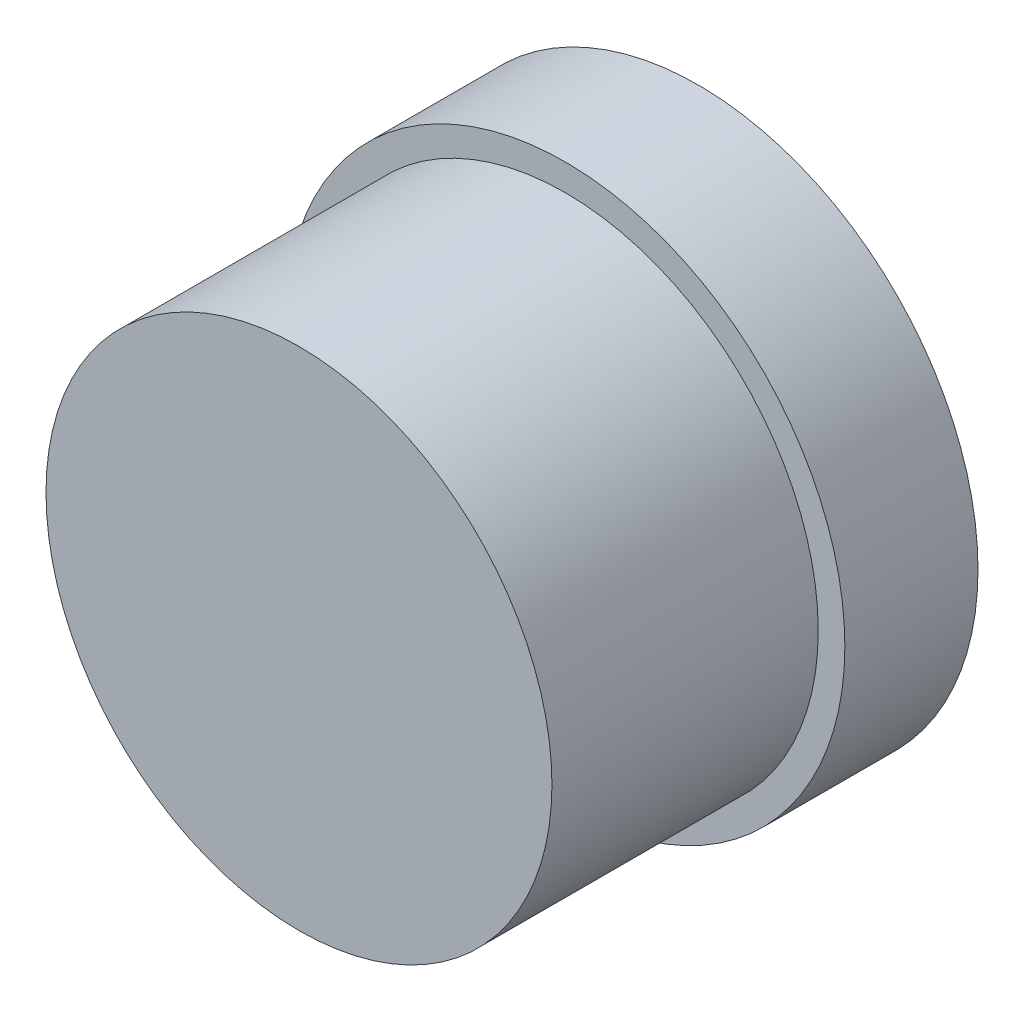
ISO-10303-21;
HEADER;
FILE_DESCRIPTION(('STEP AP214'),'2;1');
FILE_NAME('part.step','',(''),(''),'','','');
FILE_SCHEMA(('AUTOMOTIVE_DESIGN { 1 0 10303 214 1 1 1 1 }'));
ENDSEC;
DATA;
#1=APPLICATION_CONTEXT('core data for automotive mechanical design processes');
#2=APPLICATION_PROTOCOL_DEFINITION('international standard','automotive_design',2000,#1);
#3=PRODUCT_CONTEXT('',#1,'mechanical');
#4=PRODUCT('Part','Part','',(#3));
#5=PRODUCT_RELATED_PRODUCT_CATEGORY('part','',(#4));
#6=PRODUCT_DEFINITION_FORMATION('','',#4);
#7=PRODUCT_DEFINITION_CONTEXT('part definition',#1,'design');
#8=PRODUCT_DEFINITION('design','',#6,#7);
#9=PRODUCT_DEFINITION_SHAPE('','',#8);
#10=(LENGTH_UNIT() NAMED_UNIT(*) SI_UNIT(.MILLI.,.METRE.));
#11=(NAMED_UNIT(*) PLANE_ANGLE_UNIT() SI_UNIT($,.RADIAN.));
#12=(NAMED_UNIT(*) SI_UNIT($,.STERADIAN.) SOLID_ANGLE_UNIT());
#13=UNCERTAINTY_MEASURE_WITH_UNIT(LENGTH_MEASURE(1.E-05),#10,'distance_accuracy_value','');
#14=(GEOMETRIC_REPRESENTATION_CONTEXT(3) GLOBAL_UNCERTAINTY_ASSIGNED_CONTEXT((#13)) GLOBAL_UNIT_ASSIGNED_CONTEXT((#10,
#11,#12)) REPRESENTATION_CONTEXT('',''));
#15=CARTESIAN_POINT('',(0.,0.,0.));
#16=DIRECTION('',(0.,0.,1.));
#17=DIRECTION('',(1.,0.,0.));
#18=AXIS2_PLACEMENT_3D('',#15,#16,#17);
#19=CARTESIAN_POINT('',(0.,0.,100.));
#20=DIRECTION('',(0.,0.,-1.));
#21=DIRECTION('',(-1.,0.,0.));
#22=AXIS2_PLACEMENT_3D('',#19,#20,#21);
#23=CYLINDRICAL_SURFACE('',#22,210.);
#24=CARTESIAN_POINT('',(0.,0.,100.));
#25=DIRECTION('',(0.,0.,1.));
#26=DIRECTION('',(1.,0.,0.));
#27=AXIS2_PLACEMENT_3D('',#24,#25,#26);
#28=CIRCLE('',#27,210.);
#29=CARTESIAN_POINT('',(210.,0.,100.));
#30=VERTEX_POINT('',#29);
#31=EDGE_CURVE('E50',#30,#30,#28,.T.);
#32=ORIENTED_EDGE('',*,*,#31,.F.);
#33=EDGE_LOOP('',(#32));
#34=FACE_BOUND('',#33,.T.);
#35=CARTESIAN_POINT('',(0.,0.,0.));
#36=DIRECTION('',(0.,0.,1.));
#37=DIRECTION('',(1.,0.,0.));
#38=AXIS2_PLACEMENT_3D('',#35,#36,#37);
#39=CIRCLE('',#38,210.);
#40=CARTESIAN_POINT('',(210.,0.,0.));
#41=VERTEX_POINT('',#40);
#42=EDGE_CURVE('E46',#41,#41,#39,.T.);
#43=ORIENTED_EDGE('',*,*,#42,.T.);
#44=EDGE_LOOP('',(#43));
#45=FACE_BOUND('',#44,.T.);
#46=ADVANCED_FACE('F43',(#34,#45),#23,.T.);
#47=CARTESIAN_POINT('',(0.,0.,100.));
#48=DIRECTION('',(0.,0.,1.));
#49=DIRECTION('',(1.,0.,0.));
#50=AXIS2_PLACEMENT_3D('',#47,#48,#49);
#51=PLANE('',#50);
#52=CARTESIAN_POINT('',(0.,0.,100.));
#53=DIRECTION('',(0.,0.,1.));
#54=DIRECTION('',(1.,0.,0.));
#55=AXIS2_PLACEMENT_3D('',#52,#53,#54);
#56=CIRCLE('',#55,190.);
#57=CARTESIAN_POINT('',(190.,0.,100.));
#58=VERTEX_POINT('',#57);
#59=EDGE_CURVE('E10',#58,#58,#56,.T.);
#60=ORIENTED_EDGE('',*,*,#59,.F.);
#61=EDGE_LOOP('',(#60));
#62=FACE_BOUND('',#61,.T.);
#63=ORIENTED_EDGE('',*,*,#31,.T.);
#64=EDGE_LOOP('',(#63));
#65=FACE_BOUND('',#64,.T.);
#66=ADVANCED_FACE('F67',(#62,#65),#51,.T.);
#67=CARTESIAN_POINT('',(0.,0.,0.));
#68=DIRECTION('',(0.,0.,1.));
#69=DIRECTION('',(1.,0.,0.));
#70=AXIS2_PLACEMENT_3D('',#67,#68,#69);
#71=PLANE('',#70);
#72=ORIENTED_EDGE('',*,*,#42,.F.);
#73=EDGE_LOOP('',(#72));
#74=FACE_BOUND('',#73,.T.);
#75=ADVANCED_FACE('F64',(#74),#71,.F.);
#76=CARTESIAN_POINT('',(0.,0.,300.));
#77=DIRECTION('',(0.,0.,-1.));
#78=DIRECTION('',(-1.,0.,0.));
#79=AXIS2_PLACEMENT_3D('',#76,#77,#78);
#80=CYLINDRICAL_SURFACE('',#79,190.);
#81=CARTESIAN_POINT('',(0.,0.,300.));
#82=DIRECTION('',(0.,0.,1.));
#83=DIRECTION('',(1.,0.,0.));
#84=AXIS2_PLACEMENT_3D('',#81,#82,#83);
#85=CIRCLE('',#84,190.);
#86=CARTESIAN_POINT('',(190.,0.,300.));
#87=VERTEX_POINT('',#86);
#88=EDGE_CURVE('E56',#87,#87,#85,.T.);
#89=ORIENTED_EDGE('',*,*,#88,.F.);
#90=EDGE_LOOP('',(#89));
#91=FACE_BOUND('',#90,.T.);
#92=ORIENTED_EDGE('',*,*,#59,.T.);
#93=EDGE_LOOP('',(#92));
#94=FACE_BOUND('',#93,.T.);
#95=ADVANCED_FACE('F66',(#91,#94),#80,.T.);
#96=CARTESIAN_POINT('',(0.,0.,300.));
#97=DIRECTION('',(0.,0.,1.));
#98=DIRECTION('',(1.,0.,0.));
#99=AXIS2_PLACEMENT_3D('',#96,#97,#98);
#100=PLANE('',#99);
#101=ORIENTED_EDGE('',*,*,#88,.T.);
#102=EDGE_LOOP('',(#101));
#103=FACE_BOUND('',#102,.T.);
#104=ADVANCED_FACE('F72',(#103),#100,.T.);
#105=CLOSED_SHELL('',(#46,#66,#75,#95,#104));
#106=MANIFOLD_SOLID_BREP('B2',#105);
#107=ADVANCED_BREP_SHAPE_REPRESENTATION('',(#18,#106),#14);
#108=SHAPE_DEFINITION_REPRESENTATION(#9,#107);
ENDSEC;
END-ISO-10303-21;
